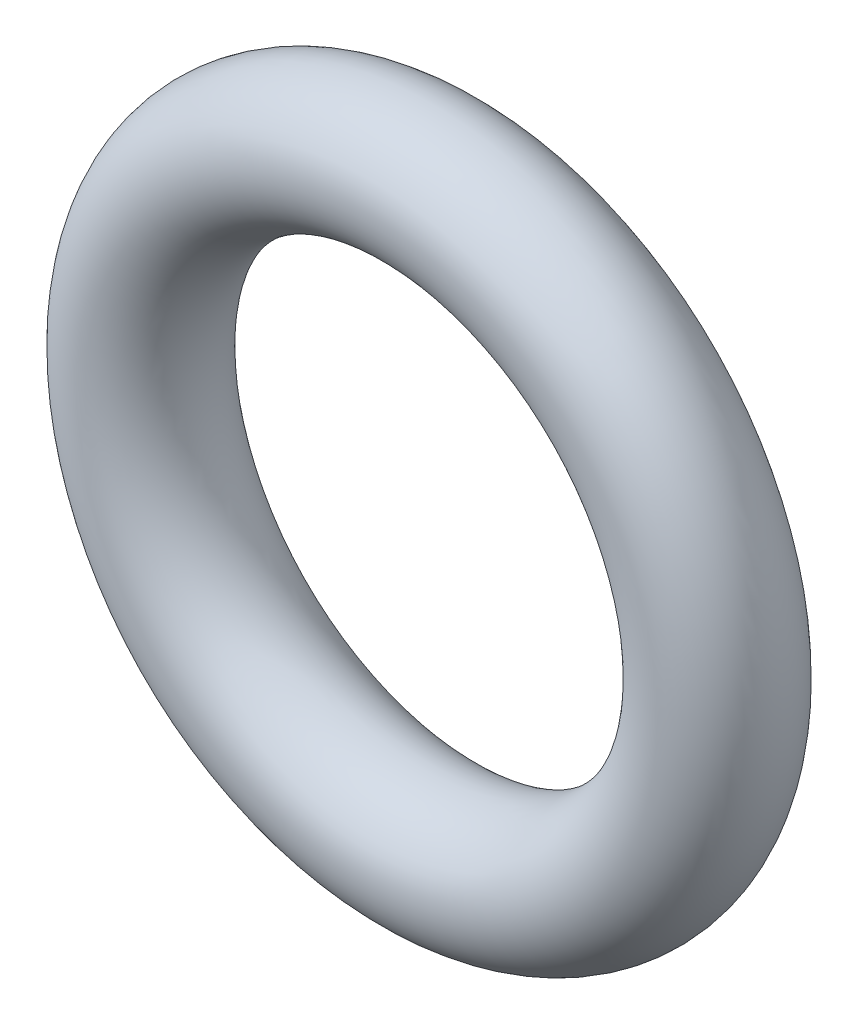
ISO-10303-21;
HEADER;
FILE_DESCRIPTION(('STEP AP214'),'2;1');
FILE_NAME('part.step','',(''),(''),'','','');
FILE_SCHEMA(('AUTOMOTIVE_DESIGN { 1 0 10303 214 1 1 1 1 }'));
ENDSEC;
DATA;
#1=APPLICATION_CONTEXT('core data for automotive mechanical design processes');
#2=APPLICATION_PROTOCOL_DEFINITION('international standard','automotive_design',2000,#1);
#3=PRODUCT_CONTEXT('',#1,'mechanical');
#4=PRODUCT('Part','Part','',(#3));
#5=PRODUCT_RELATED_PRODUCT_CATEGORY('part','',(#4));
#6=PRODUCT_DEFINITION_FORMATION('','',#4);
#7=PRODUCT_DEFINITION_CONTEXT('part definition',#1,'design');
#8=PRODUCT_DEFINITION('design','',#6,#7);
#9=PRODUCT_DEFINITION_SHAPE('','',#8);
#10=(LENGTH_UNIT() NAMED_UNIT(*) SI_UNIT(.MILLI.,.METRE.));
#11=(NAMED_UNIT(*) PLANE_ANGLE_UNIT() SI_UNIT($,.RADIAN.));
#12=(NAMED_UNIT(*) SI_UNIT($,.STERADIAN.) SOLID_ANGLE_UNIT());
#13=UNCERTAINTY_MEASURE_WITH_UNIT(LENGTH_MEASURE(1.E-05),#10,'distance_accuracy_value','');
#14=(GEOMETRIC_REPRESENTATION_CONTEXT(3) GLOBAL_UNCERTAINTY_ASSIGNED_CONTEXT((#13)) GLOBAL_UNIT_ASSIGNED_CONTEXT((#10,
#11,#12)) REPRESENTATION_CONTEXT('',''));
#15=CARTESIAN_POINT('',(0.,0.,0.));
#16=DIRECTION('',(0.,0.,1.));
#17=DIRECTION('',(1.,0.,0.));
#18=AXIS2_PLACEMENT_3D('',#15,#16,#17);
#19=CARTESIAN_POINT('',(0.,0.,0.));
#20=DIRECTION('',(0.,0.,1.));
#21=DIRECTION('',(1.,0.,0.));
#22=AXIS2_PLACEMENT_3D('',#19,#20,#21);
#23=TOROIDAL_SURFACE('',#22,3.25,0.75);
#24=CARTESIAN_POINT('',(3.25,0.,0.));
#25=DIRECTION('',(0.,1.,0.));
#26=DIRECTION('',(-1.,0.,0.));
#27=AXIS2_PLACEMENT_3D('',#24,#25,#26);
#28=CIRCLE('',#27,0.75);
#29=CARTESIAN_POINT('',(4.,0.,0.));
#30=VERTEX_POINT('',#29);
#31=EDGE_CURVE('E11',#30,#30,#28,.T.);
#32=CARTESIAN_POINT('',(0.,0.,0.));
#33=DIRECTION('',(0.,0.,1.));
#34=DIRECTION('',(1.,0.,0.));
#35=AXIS2_PLACEMENT_3D('',#32,#33,#34);
#36=CIRCLE('',#35,4.);
#37=EDGE_CURVE('',#30,#30,#36,.T.);
#38=ORIENTED_EDGE('',*,*,#31,.T.);
#39=ORIENTED_EDGE('',*,*,#31,.F.);
#40=ORIENTED_EDGE('',*,*,#37,.T.);
#41=ORIENTED_EDGE('',*,*,#37,.F.);
#42=EDGE_LOOP('',(#38,#40,#39,#41));
#43=FACE_BOUND('',#42,.T.);
#44=ADVANCED_FACE('F51',(#43),#23,.T.);
#45=CLOSED_SHELL('',(#44));
#46=MANIFOLD_SOLID_BREP('B2',#45);
#47=ADVANCED_BREP_SHAPE_REPRESENTATION('',(#18,#46),#14);
#48=SHAPE_DEFINITION_REPRESENTATION(#9,#47);
ENDSEC;
END-ISO-10303-21;
